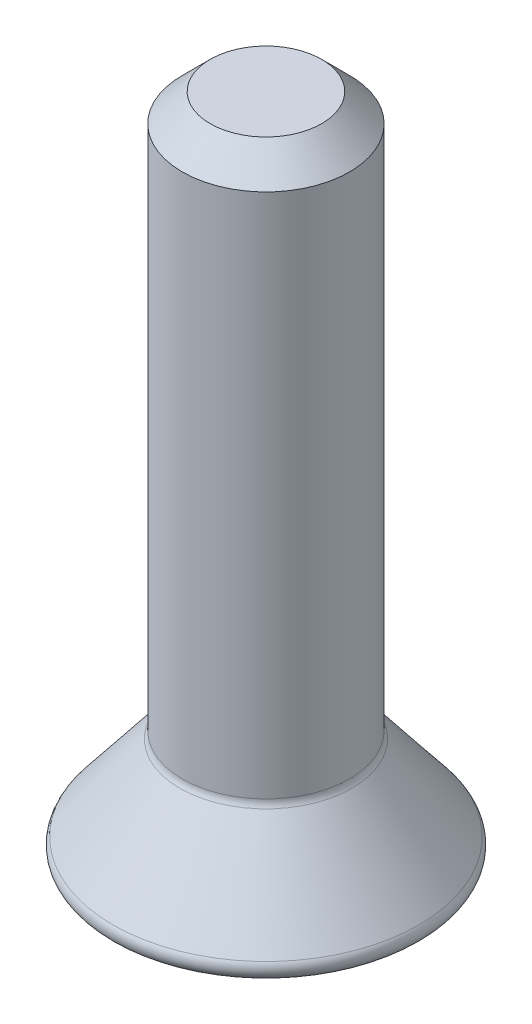
ISO-10303-21;
HEADER;
FILE_DESCRIPTION(('STEP AP214'),'2;1');
FILE_NAME('part.step','',(''),(''),'','','');
FILE_SCHEMA(('AUTOMOTIVE_DESIGN { 1 0 10303 214 1 1 1 1 }'));
ENDSEC;
DATA;
#1=APPLICATION_CONTEXT('core data for automotive mechanical design processes');
#2=APPLICATION_PROTOCOL_DEFINITION('international standard','automotive_design',2000,#1);
#3=PRODUCT_CONTEXT('',#1,'mechanical');
#4=PRODUCT('Part','Part','',(#3));
#5=PRODUCT_RELATED_PRODUCT_CATEGORY('part','',(#4));
#6=PRODUCT_DEFINITION_FORMATION('','',#4);
#7=PRODUCT_DEFINITION_CONTEXT('part definition',#1,'design');
#8=PRODUCT_DEFINITION('design','',#6,#7);
#9=PRODUCT_DEFINITION_SHAPE('','',#8);
#10=(LENGTH_UNIT() NAMED_UNIT(*) SI_UNIT(.MILLI.,.METRE.));
#11=(NAMED_UNIT(*) PLANE_ANGLE_UNIT() SI_UNIT($,.RADIAN.));
#12=(NAMED_UNIT(*) SI_UNIT($,.STERADIAN.) SOLID_ANGLE_UNIT());
#13=UNCERTAINTY_MEASURE_WITH_UNIT(LENGTH_MEASURE(1.E-05),#10,'distance_accuracy_value','');
#14=(GEOMETRIC_REPRESENTATION_CONTEXT(3) GLOBAL_UNCERTAINTY_ASSIGNED_CONTEXT((#13)) GLOBAL_UNIT_ASSIGNED_CONTEXT((#10,
#11,#12)) REPRESENTATION_CONTEXT('',''));
#15=CARTESIAN_POINT('',(0.,0.,0.));
#16=DIRECTION('',(0.,0.,1.));
#17=DIRECTION('',(1.,0.,0.));
#18=AXIS2_PLACEMENT_3D('',#15,#16,#17);
#19=CARTESIAN_POINT('',(0.,0.,0.));
#20=DIRECTION('',(0.,-1.,0.));
#21=DIRECTION('',(0.,0.,-1.));
#22=AXIS2_PLACEMENT_3D('',#19,#20,#21);
#23=CONICAL_SURFACE('',#22,3.,0.668289418830584);
#24=CARTESIAN_POINT('',(0.,1.84550363393513,0.));
#25=DIRECTION('',(0.,-1.,0.));
#26=DIRECTION('',(0.,0.,-1.));
#27=AXIS2_PLACEMENT_3D('',#24,#25,#26);
#28=CIRCLE('',#27,1.54302344689331);
#29=CARTESIAN_POINT('',(0.,1.84550363393513,-1.54302344689331));
#30=VERTEX_POINT('',#29);
#31=EDGE_CURVE('E56',#30,#30,#28,.T.);
#32=ORIENTED_EDGE('',*,*,#31,.T.);
#33=EDGE_LOOP('',(#32));
#34=FACE_BOUND('',#33,.T.);
#35=CARTESIAN_POINT('',(0.,0.323928857715805,0.));
#36=DIRECTION('',(0.,1.,0.));
#37=DIRECTION('',(0.,0.,1.));
#38=AXIS2_PLACEMENT_3D('',#35,#36,#37);
#39=CIRCLE('',#38,2.744266691277);
#40=CARTESIAN_POINT('',(0.,0.323928857715805,2.744266691277));
#41=VERTEX_POINT('',#40);
#42=EDGE_CURVE('E183',#41,#41,#39,.T.);
#43=ORIENTED_EDGE('',*,*,#42,.T.);
#44=EDGE_LOOP('',(#43));
#45=FACE_BOUND('',#44,.T.);
#46=ADVANCED_FACE('F47',(#34,#45),#23,.T.);
#47=CARTESIAN_POINT('',(3.,0.,0.));
#48=DIRECTION('',(0.,1.,0.));
#49=DIRECTION('',(0.,0.,1.));
#50=AXIS2_PLACEMENT_3D('',#47,#48,#49);
#51=PLANE('',#50);
#52=CARTESIAN_POINT('',(0.,0.,0.));
#53=DIRECTION('',(0.,1.,0.));
#54=DIRECTION('',(0.,0.,1.));
#55=AXIS2_PLACEMENT_3D('',#52,#53,#54);
#56=CIRCLE('',#55,2.58729013817031);
#57=CARTESIAN_POINT('',(0.,0.,2.58729013817031));
#58=VERTEX_POINT('',#57);
#59=EDGE_CURVE('E11',#58,#58,#56,.F.);
#60=ORIENTED_EDGE('',*,*,#59,.T.);
#61=EDGE_LOOP('',(#60));
#62=FACE_BOUND('',#61,.T.);
#63=DIRECTION('',(-0.866025403784439,0.,-0.5));
#64=VECTOR('',#63,1.);
#65=CARTESIAN_POINT('',(0.,0.,1.15470053837925));
#66=LINE('',#65,#64);
#67=CARTESIAN_POINT('',(0.,0.,1.15470053837925));
#68=VERTEX_POINT('',#67);
#69=CARTESIAN_POINT('',(-1.,0.,0.577350269189626));
#70=VERTEX_POINT('',#69);
#71=EDGE_CURVE('E143',#68,#70,#66,.T.);
#72=ORIENTED_EDGE('',*,*,#71,.F.);
#73=DIRECTION('',(-0.866025403784439,0.,0.5));
#74=VECTOR('',#73,1.);
#75=CARTESIAN_POINT('',(1.,0.,0.577350269189626));
#76=LINE('',#75,#74);
#77=CARTESIAN_POINT('',(1.,0.,0.577350269189626));
#78=VERTEX_POINT('',#77);
#79=EDGE_CURVE('E63',#78,#68,#76,.T.);
#80=ORIENTED_EDGE('',*,*,#79,.F.);
#81=DIRECTION('',(0.,0.,1.));
#82=VECTOR('',#81,1.);
#83=CARTESIAN_POINT('',(1.,0.,-0.577350269189626));
#84=LINE('',#83,#82);
#85=CARTESIAN_POINT('',(1.,0.,-0.577350269189626));
#86=VERTEX_POINT('',#85);
#87=EDGE_CURVE('E156',#86,#78,#84,.T.);
#88=ORIENTED_EDGE('',*,*,#87,.F.);
#89=DIRECTION('',(0.866025403784439,0.,0.5));
#90=VECTOR('',#89,1.);
#91=CARTESIAN_POINT('',(0.,0.,-1.15470053837925));
#92=LINE('',#91,#90);
#93=CARTESIAN_POINT('',(0.,0.,-1.15470053837925));
#94=VERTEX_POINT('',#93);
#95=EDGE_CURVE('E153',#94,#86,#92,.T.);
#96=ORIENTED_EDGE('',*,*,#95,.F.);
#97=DIRECTION('',(0.866025403784439,0.,-0.5));
#98=VECTOR('',#97,1.);
#99=CARTESIAN_POINT('',(-1.,0.,-0.577350269189626));
#100=LINE('',#99,#98);
#101=CARTESIAN_POINT('',(-1.,0.,-0.577350269189626));
#102=VERTEX_POINT('',#101);
#103=EDGE_CURVE('E111',#102,#94,#100,.T.);
#104=ORIENTED_EDGE('',*,*,#103,.F.);
#105=DIRECTION('',(0.,0.,-1.));
#106=VECTOR('',#105,1.);
#107=CARTESIAN_POINT('',(-1.,0.,0.577350269189626));
#108=LINE('',#107,#106);
#109=EDGE_CURVE('E147',#70,#102,#108,.T.);
#110=ORIENTED_EDGE('',*,*,#109,.F.);
#111=EDGE_LOOP('',(#72,#80,#88,#96,#104,#110));
#112=FACE_BOUND('',#111,.T.);
#113=ADVANCED_FACE('F202',(#62,#112),#51,.F.);
#114=CARTESIAN_POINT('',(0.,11.9,0.));
#115=DIRECTION('',(0.,-1.,0.));
#116=DIRECTION('',(0.,0.,-1.));
#117=AXIS2_PLACEMENT_3D('',#114,#115,#116);
#118=CYLINDRICAL_SURFACE('',#117,1.5);
#119=CARTESIAN_POINT('',(0.,1.96943249165094,0.));
#120=DIRECTION('',(0.,1.,0.));
#121=DIRECTION('',(0.,0.,1.));
#122=AXIS2_PLACEMENT_3D('',#119,#120,#121);
#123=CIRCLE('',#122,1.5);
#124=CARTESIAN_POINT('',(0.,1.96943249165094,1.5));
#125=VERTEX_POINT('',#124);
#126=EDGE_CURVE('E179',#125,#125,#123,.T.);
#127=ORIENTED_EDGE('',*,*,#126,.T.);
#128=EDGE_LOOP('',(#127));
#129=FACE_BOUND('',#128,.T.);
#130=CARTESIAN_POINT('',(0.,11.4,0.));
#131=DIRECTION('',(0.,1.,0.));
#132=DIRECTION('',(0.,0.,1.));
#133=AXIS2_PLACEMENT_3D('',#130,#131,#132);
#134=CIRCLE('',#133,1.5);
#135=CARTESIAN_POINT('',(0.,11.4,1.5));
#136=VERTEX_POINT('',#135);
#137=EDGE_CURVE('E175',#136,#136,#134,.F.);
#138=ORIENTED_EDGE('',*,*,#137,.T.);
#139=EDGE_LOOP('',(#138));
#140=FACE_BOUND('',#139,.T.);
#141=ADVANCED_FACE('F198',(#129,#140),#118,.T.);
#142=CARTESIAN_POINT('',(0.,11.9,0.));
#143=DIRECTION('',(0.,1.,0.));
#144=DIRECTION('',(0.,0.,1.));
#145=AXIS2_PLACEMENT_3D('',#142,#143,#144);
#146=PLANE('',#145);
#147=CARTESIAN_POINT('',(0.,11.9,0.));
#148=DIRECTION('',(0.,1.,0.));
#149=DIRECTION('',(0.,0.,1.));
#150=AXIS2_PLACEMENT_3D('',#147,#148,#149);
#151=CIRCLE('',#150,0.999999999999999);
#152=CARTESIAN_POINT('',(0.,11.9,0.999999999999999));
#153=VERTEX_POINT('',#152);
#154=EDGE_CURVE('E162',#153,#153,#151,.T.);
#155=ORIENTED_EDGE('',*,*,#154,.T.);
#156=EDGE_LOOP('',(#155));
#157=FACE_BOUND('',#156,.T.);
#158=ADVANCED_FACE('F201',(#157),#146,.T.);
#159=CARTESIAN_POINT('',(1.,1.,0.577350269189626));
#160=DIRECTION('',(0.5,0.,0.866025403784439));
#161=DIRECTION('',(0.866025403784439,0.,-0.5));
#162=AXIS2_PLACEMENT_3D('',#159,#160,#161);
#163=PLANE('',#162);
#164=ORIENTED_EDGE('',*,*,#79,.T.);
#165=DIRECTION('',(0.,-1.,0.));
#166=VECTOR('',#165,1.);
#167=CARTESIAN_POINT('',(0.,1.,1.15470053837925));
#168=LINE('',#167,#166);
#169=CARTESIAN_POINT('',(0.,1.,1.15470053837925));
#170=VERTEX_POINT('',#169);
#171=EDGE_CURVE('E93',#170,#68,#168,.T.);
#172=ORIENTED_EDGE('',*,*,#171,.F.);
#173=DIRECTION('',(-0.866025403784439,0.,0.5));
#174=VECTOR('',#173,1.);
#175=CARTESIAN_POINT('',(1.,1.,0.577350269189626));
#176=LINE('',#175,#174);
#177=CARTESIAN_POINT('',(1.,1.,0.577350269189626));
#178=VERTEX_POINT('',#177);
#179=EDGE_CURVE('E159',#178,#170,#176,.T.);
#180=ORIENTED_EDGE('',*,*,#179,.F.);
#181=DIRECTION('',(0.,-1.,0.));
#182=VECTOR('',#181,1.);
#183=CARTESIAN_POINT('',(1.,1.,0.577350269189626));
#184=LINE('',#183,#182);
#185=EDGE_CURVE('E71',#178,#78,#184,.T.);
#186=ORIENTED_EDGE('',*,*,#185,.T.);
#187=EDGE_LOOP('',(#164,#172,#180,#186));
#188=FACE_BOUND('',#187,.T.);
#189=ADVANCED_FACE('F212',(#188),#163,.F.);
#190=CARTESIAN_POINT('',(1.,1.,-0.577350269189626));
#191=DIRECTION('',(1.,0.,0.));
#192=DIRECTION('',(0.,0.,-1.));
#193=AXIS2_PLACEMENT_3D('',#190,#191,#192);
#194=PLANE('',#193);
#195=ORIENTED_EDGE('',*,*,#87,.T.);
#196=ORIENTED_EDGE('',*,*,#185,.F.);
#197=DIRECTION('',(0.,0.,1.));
#198=VECTOR('',#197,1.);
#199=CARTESIAN_POINT('',(1.,1.,-0.577350269189626));
#200=LINE('',#199,#198);
#201=CARTESIAN_POINT('',(1.,1.,-0.577350269189626));
#202=VERTEX_POINT('',#201);
#203=EDGE_CURVE('E125',#202,#178,#200,.T.);
#204=ORIENTED_EDGE('',*,*,#203,.F.);
#205=DIRECTION('',(0.,-1.,0.));
#206=VECTOR('',#205,1.);
#207=CARTESIAN_POINT('',(1.,1.,-0.577350269189626));
#208=LINE('',#207,#206);
#209=EDGE_CURVE('E116',#202,#86,#208,.T.);
#210=ORIENTED_EDGE('',*,*,#209,.T.);
#211=EDGE_LOOP('',(#195,#196,#204,#210));
#212=FACE_BOUND('',#211,.T.);
#213=ADVANCED_FACE('F218',(#212),#194,.F.);
#214=CARTESIAN_POINT('',(0.,1.,-1.15470053837925));
#215=DIRECTION('',(0.5,0.,-0.866025403784439));
#216=DIRECTION('',(-0.866025403784439,0.,-0.5));
#217=AXIS2_PLACEMENT_3D('',#214,#215,#216);
#218=PLANE('',#217);
#219=ORIENTED_EDGE('',*,*,#95,.T.);
#220=ORIENTED_EDGE('',*,*,#209,.F.);
#221=DIRECTION('',(0.866025403784439,0.,0.5));
#222=VECTOR('',#221,1.);
#223=CARTESIAN_POINT('',(0.,1.,-1.15470053837925));
#224=LINE('',#223,#222);
#225=CARTESIAN_POINT('',(0.,1.,-1.15470053837925));
#226=VERTEX_POINT('',#225);
#227=EDGE_CURVE('E120',#226,#202,#224,.T.);
#228=ORIENTED_EDGE('',*,*,#227,.F.);
#229=DIRECTION('',(0.,-1.,0.));
#230=VECTOR('',#229,1.);
#231=CARTESIAN_POINT('',(0.,1.,-1.15470053837925));
#232=LINE('',#231,#230);
#233=EDGE_CURVE('E104',#226,#94,#232,.T.);
#234=ORIENTED_EDGE('',*,*,#233,.T.);
#235=EDGE_LOOP('',(#219,#220,#228,#234));
#236=FACE_BOUND('',#235,.T.);
#237=ADVANCED_FACE('F121',(#236),#218,.F.);
#238=CARTESIAN_POINT('',(-1.,1.,-0.577350269189626));
#239=DIRECTION('',(-0.5,0.,-0.866025403784439));
#240=DIRECTION('',(-0.866025403784439,0.,0.5));
#241=AXIS2_PLACEMENT_3D('',#238,#239,#240);
#242=PLANE('',#241);
#243=ORIENTED_EDGE('',*,*,#103,.T.);
#244=ORIENTED_EDGE('',*,*,#233,.F.);
#245=DIRECTION('',(0.866025403784439,0.,-0.5));
#246=VECTOR('',#245,1.);
#247=CARTESIAN_POINT('',(-1.,1.,-0.577350269189626));
#248=LINE('',#247,#246);
#249=CARTESIAN_POINT('',(-1.,1.,-0.577350269189626));
#250=VERTEX_POINT('',#249);
#251=EDGE_CURVE('E108',#250,#226,#248,.T.);
#252=ORIENTED_EDGE('',*,*,#251,.F.);
#253=DIRECTION('',(0.,-1.,0.));
#254=VECTOR('',#253,1.);
#255=CARTESIAN_POINT('',(-1.,1.,-0.577350269189626));
#256=LINE('',#255,#254);
#257=EDGE_CURVE('E117',#250,#102,#256,.T.);
#258=ORIENTED_EDGE('',*,*,#257,.T.);
#259=EDGE_LOOP('',(#243,#244,#252,#258));
#260=FACE_BOUND('',#259,.T.);
#261=ADVANCED_FACE('F106',(#260),#242,.F.);
#262=CARTESIAN_POINT('',(-1.,1.,0.577350269189626));
#263=DIRECTION('',(-1.,0.,0.));
#264=DIRECTION('',(0.,0.,1.));
#265=AXIS2_PLACEMENT_3D('',#262,#263,#264);
#266=PLANE('',#265);
#267=ORIENTED_EDGE('',*,*,#109,.T.);
#268=ORIENTED_EDGE('',*,*,#257,.F.);
#269=DIRECTION('',(0.,0.,-1.));
#270=VECTOR('',#269,1.);
#271=CARTESIAN_POINT('',(-1.,1.,0.577350269189626));
#272=LINE('',#271,#270);
#273=CARTESIAN_POINT('',(-1.,1.,0.577350269189626));
#274=VERTEX_POINT('',#273);
#275=EDGE_CURVE('E131',#274,#250,#272,.T.);
#276=ORIENTED_EDGE('',*,*,#275,.F.);
#277=DIRECTION('',(0.,-1.,0.));
#278=VECTOR('',#277,1.);
#279=CARTESIAN_POINT('',(-1.,1.,0.577350269189626));
#280=LINE('',#279,#278);
#281=EDGE_CURVE('E167',#274,#70,#280,.T.);
#282=ORIENTED_EDGE('',*,*,#281,.T.);
#283=EDGE_LOOP('',(#267,#268,#276,#282));
#284=FACE_BOUND('',#283,.T.);
#285=ADVANCED_FACE('F252',(#284),#266,.F.);
#286=CARTESIAN_POINT('',(0.,1.,1.15470053837925));
#287=DIRECTION('',(-0.5,0.,0.866025403784439));
#288=DIRECTION('',(0.866025403784439,0.,0.5));
#289=AXIS2_PLACEMENT_3D('',#286,#287,#288);
#290=PLANE('',#289);
#291=ORIENTED_EDGE('',*,*,#71,.T.);
#292=ORIENTED_EDGE('',*,*,#281,.F.);
#293=DIRECTION('',(-0.866025403784439,0.,-0.5));
#294=VECTOR('',#293,1.);
#295=CARTESIAN_POINT('',(0.,1.,1.15470053837925));
#296=LINE('',#295,#294);
#297=EDGE_CURVE('E135',#170,#274,#296,.T.);
#298=ORIENTED_EDGE('',*,*,#297,.F.);
#299=ORIENTED_EDGE('',*,*,#171,.T.);
#300=EDGE_LOOP('',(#291,#292,#298,#299));
#301=FACE_BOUND('',#300,.T.);
#302=ADVANCED_FACE('F238',(#301),#290,.F.);
#303=CARTESIAN_POINT('',(0.,1.,0.));
#304=DIRECTION('',(0.,-1.,0.));
#305=DIRECTION('',(0.,0.,-1.));
#306=AXIS2_PLACEMENT_3D('',#303,#304,#305);
#307=PLANE('',#306);
#308=ORIENTED_EDGE('',*,*,#179,.T.);
#309=ORIENTED_EDGE('',*,*,#297,.T.);
#310=ORIENTED_EDGE('',*,*,#275,.T.);
#311=ORIENTED_EDGE('',*,*,#251,.T.);
#312=ORIENTED_EDGE('',*,*,#227,.T.);
#313=ORIENTED_EDGE('',*,*,#203,.T.);
#314=EDGE_LOOP('',(#308,#309,#310,#311,#312,#313));
#315=FACE_BOUND('',#314,.T.);
#316=ADVANCED_FACE('F128',(#315),#307,.T.);
#317=CARTESIAN_POINT('',(0.,11.9,0.));
#318=DIRECTION('',(0.,-1.,0.));
#319=DIRECTION('',(0.,0.,-1.));
#320=AXIS2_PLACEMENT_3D('',#317,#318,#319);
#321=CONICAL_SURFACE('',#320,0.999999999999999,0.785398163397447);
#322=ORIENTED_EDGE('',*,*,#137,.F.);
#323=EDGE_LOOP('',(#322));
#324=FACE_BOUND('',#323,.T.);
#325=ORIENTED_EDGE('',*,*,#154,.F.);
#326=EDGE_LOOP('',(#325));
#327=FACE_BOUND('',#326,.T.);
#328=ADVANCED_FACE('F195',(#324,#327),#321,.T.);
#329=CARTESIAN_POINT('',(0.,1.96943249165094,0.));
#330=DIRECTION('',(0.,1.,0.));
#331=DIRECTION('',(0.,0.,1.));
#332=AXIS2_PLACEMENT_3D('',#329,#330,#331);
#333=TOROIDAL_SURFACE('',#332,1.7,0.2);
#334=ORIENTED_EDGE('',*,*,#31,.F.);
#335=EDGE_LOOP('',(#334));
#336=FACE_BOUND('',#335,.T.);
#337=ORIENTED_EDGE('',*,*,#126,.F.);
#338=EDGE_LOOP('',(#337));
#339=FACE_BOUND('',#338,.T.);
#340=ADVANCED_FACE('F192',(#336,#339),#333,.F.);
#341=CARTESIAN_POINT('',(0.,0.2,0.));
#342=DIRECTION('',(0.,1.,0.));
#343=DIRECTION('',(0.,0.,1.));
#344=AXIS2_PLACEMENT_3D('',#341,#342,#343);
#345=TOROIDAL_SURFACE('',#344,2.58729013817031,0.2);
#346=ORIENTED_EDGE('',*,*,#59,.F.);
#347=EDGE_LOOP('',(#346));
#348=FACE_BOUND('',#347,.T.);
#349=ORIENTED_EDGE('',*,*,#42,.F.);
#350=EDGE_LOOP('',(#349));
#351=FACE_BOUND('',#350,.T.);
#352=ADVANCED_FACE('F49',(#348,#351),#345,.T.);
#353=CLOSED_SHELL('',(#46,#113,#141,#158,#189,#213,#237,#261,#285,#302,#316,#328,#340,#352));
#354=MANIFOLD_SOLID_BREP('B2',#353);
#355=ADVANCED_BREP_SHAPE_REPRESENTATION('',(#18,#354),#14);
#356=SHAPE_DEFINITION_REPRESENTATION(#9,#355);
ENDSEC;
END-ISO-10303-21;
